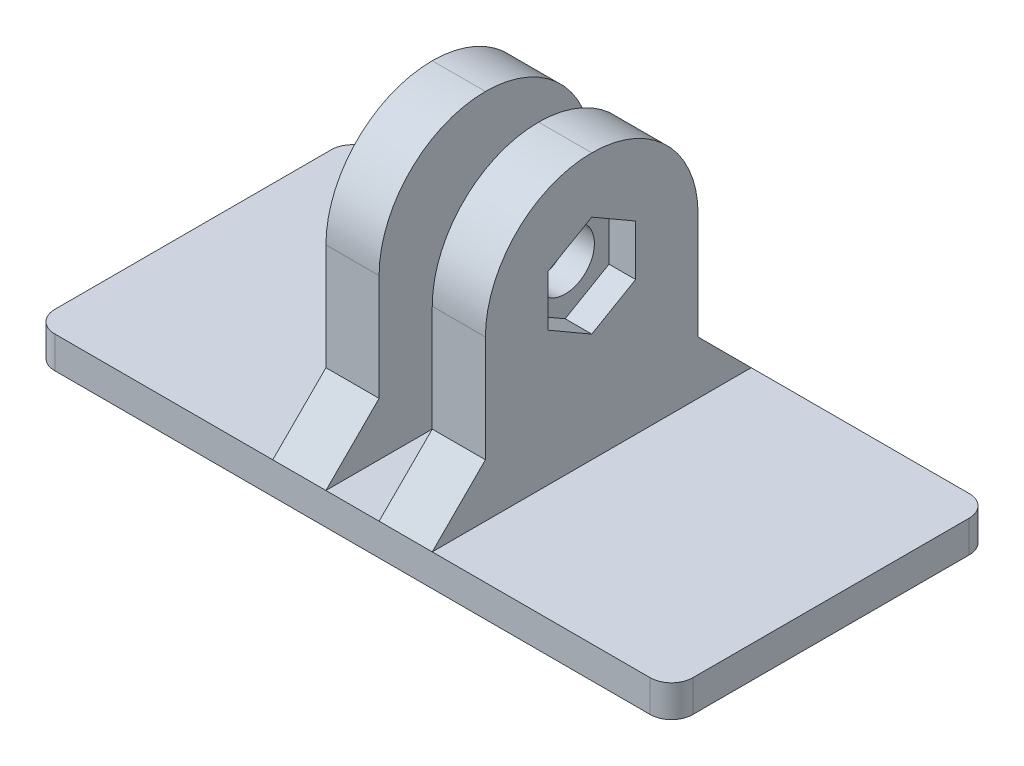
ISO-10303-21;
HEADER;
FILE_DESCRIPTION(('STEP AP214'),'2;1');
FILE_NAME('part.step','',(''),(''),'','','');
FILE_SCHEMA(('AUTOMOTIVE_DESIGN { 1 0 10303 214 1 1 1 1 }'));
ENDSEC;
DATA;
#1=APPLICATION_CONTEXT('core data for automotive mechanical design processes');
#2=APPLICATION_PROTOCOL_DEFINITION('international standard','automotive_design',2000,#1);
#3=PRODUCT_CONTEXT('',#1,'mechanical');
#4=PRODUCT('Part','Part','',(#3));
#5=PRODUCT_RELATED_PRODUCT_CATEGORY('part','',(#4));
#6=PRODUCT_DEFINITION_FORMATION('','',#4);
#7=PRODUCT_DEFINITION_CONTEXT('part definition',#1,'design');
#8=PRODUCT_DEFINITION('design','',#6,#7);
#9=PRODUCT_DEFINITION_SHAPE('','',#8);
#10=(LENGTH_UNIT() NAMED_UNIT(*) SI_UNIT(.MILLI.,.METRE.));
#11=(NAMED_UNIT(*) PLANE_ANGLE_UNIT() SI_UNIT($,.RADIAN.));
#12=(NAMED_UNIT(*) SI_UNIT($,.STERADIAN.) SOLID_ANGLE_UNIT());
#13=UNCERTAINTY_MEASURE_WITH_UNIT(LENGTH_MEASURE(1.E-05),#10,'distance_accuracy_value','');
#14=(GEOMETRIC_REPRESENTATION_CONTEXT(3) GLOBAL_UNCERTAINTY_ASSIGNED_CONTEXT((#13)) GLOBAL_UNIT_ASSIGNED_CONTEXT((#10,
#11,#12)) REPRESENTATION_CONTEXT('',''));
#15=CARTESIAN_POINT('',(0.,0.,0.));
#16=DIRECTION('',(0.,0.,1.));
#17=DIRECTION('',(1.,0.,0.));
#18=AXIS2_PLACEMENT_3D('',#15,#16,#17);
#19=CARTESIAN_POINT('',(0.,3.,0.));
#20=DIRECTION('',(0.,1.,0.));
#21=DIRECTION('',(0.,0.,1.));
#22=AXIS2_PLACEMENT_3D('',#19,#20,#21);
#23=PLANE('',#22);
#24=DIRECTION('',(0.,0.,1.));
#25=VECTOR('',#24,1.);
#26=CARTESIAN_POINT('',(2.49999999999994,3.,-9.99999999999999));
#27=LINE('',#26,#25);
#28=CARTESIAN_POINT('',(2.49999999999994,3.,-15.));
#29=VERTEX_POINT('',#28);
#30=CARTESIAN_POINT('',(2.49999999999994,3.,15.));
#31=VERTEX_POINT('',#30);
#32=EDGE_CURVE('E316',#29,#31,#27,.T.);
#33=ORIENTED_EDGE('',*,*,#32,.F.);
#34=DIRECTION('',(-1.,0.,0.));
#35=VECTOR('',#34,1.);
#36=CARTESIAN_POINT('',(-30.,3.,-15.));
#37=LINE('',#36,#35);
#38=CARTESIAN_POINT('',(-2.5,3.,-15.));
#39=VERTEX_POINT('',#38);
#40=EDGE_CURVE('E943',#29,#39,#37,.T.);
#41=ORIENTED_EDGE('',*,*,#40,.T.);
#42=DIRECTION('',(0.,0.,-1.));
#43=VECTOR('',#42,1.);
#44=CARTESIAN_POINT('',(-2.5,3.,-9.99999999999999));
#45=LINE('',#44,#43);
#46=CARTESIAN_POINT('',(-2.5,3.,15.));
#47=VERTEX_POINT('',#46);
#48=EDGE_CURVE('E338',#47,#39,#45,.T.);
#49=ORIENTED_EDGE('',*,*,#48,.F.);
#50=DIRECTION('',(1.,0.,0.));
#51=VECTOR('',#50,1.);
#52=CARTESIAN_POINT('',(-30.,3.,15.));
#53=LINE('',#52,#51);
#54=EDGE_CURVE('E549',#47,#31,#53,.T.);
#55=ORIENTED_EDGE('',*,*,#54,.T.);
#56=EDGE_LOOP('',(#33,#41,#49,#55));
#57=FACE_BOUND('',#56,.T.);
#58=ADVANCED_FACE('F39',(#57),#23,.T.);
#59=DIRECTION('',(0.,0.,1.));
#60=VECTOR('',#59,1.);
#61=CARTESIAN_POINT('',(-7.5,3.,-10.));
#62=LINE('',#61,#60);
#63=CARTESIAN_POINT('',(-7.5,3.,-15.));
#64=VERTEX_POINT('',#63);
#65=CARTESIAN_POINT('',(-7.5,3.,15.));
#66=VERTEX_POINT('',#65);
#67=EDGE_CURVE('E341',#64,#66,#62,.T.);
#68=ORIENTED_EDGE('',*,*,#67,.F.);
#69=CARTESIAN_POINT('',(-28.,3.,-15.));
#70=VERTEX_POINT('',#69);
#71=EDGE_CURVE('E376',#64,#70,#37,.T.);
#72=ORIENTED_EDGE('',*,*,#71,.T.);
#73=CARTESIAN_POINT('',(-28.,3.,-13.));
#74=DIRECTION('',(0.,1.,0.));
#75=DIRECTION('',(0.,0.,1.));
#76=AXIS2_PLACEMENT_3D('',#73,#74,#75);
#77=CIRCLE('',#76,2.);
#78=CARTESIAN_POINT('',(-30.,3.,-13.));
#79=VERTEX_POINT('',#78);
#80=EDGE_CURVE('E423',#70,#79,#77,.T.);
#81=ORIENTED_EDGE('',*,*,#80,.T.);
#82=DIRECTION('',(0.,0.,1.));
#83=VECTOR('',#82,1.);
#84=CARTESIAN_POINT('',(-30.,3.,-15.));
#85=LINE('',#84,#83);
#86=CARTESIAN_POINT('',(-30.,3.,13.));
#87=VERTEX_POINT('',#86);
#88=EDGE_CURVE('E361',#79,#87,#85,.T.);
#89=ORIENTED_EDGE('',*,*,#88,.T.);
#90=CARTESIAN_POINT('',(-28.,3.,13.));
#91=DIRECTION('',(0.,1.,0.));
#92=DIRECTION('',(0.,0.,1.));
#93=AXIS2_PLACEMENT_3D('',#90,#91,#92);
#94=CIRCLE('',#93,2.);
#95=CARTESIAN_POINT('',(-28.,3.,15.));
#96=VERTEX_POINT('',#95);
#97=EDGE_CURVE('E426',#87,#96,#94,.T.);
#98=ORIENTED_EDGE('',*,*,#97,.T.);
#99=EDGE_CURVE('E367',#96,#66,#53,.T.);
#100=ORIENTED_EDGE('',*,*,#99,.T.);
#101=EDGE_LOOP('',(#68,#72,#81,#89,#98,#100));
#102=FACE_BOUND('',#101,.T.);
#103=ADVANCED_FACE('F562',(#102),#23,.T.);
#104=CARTESIAN_POINT('',(30.,18.,0.));
#105=DIRECTION('',(-1.,0.,0.));
#106=DIRECTION('',(0.,0.,1.));
#107=AXIS2_PLACEMENT_3D('',#104,#105,#106);
#108=CYLINDRICAL_SURFACE('',#107,2.75);
#109=CARTESIAN_POINT('',(2.49999999999994,18.,0.));
#110=DIRECTION('',(1.,0.,0.));
#111=DIRECTION('',(0.,0.,-1.));
#112=AXIS2_PLACEMENT_3D('',#109,#110,#111);
#113=CIRCLE('',#112,2.75);
#114=CARTESIAN_POINT('',(2.49999999999994,18.,-2.75));
#115=VERTEX_POINT('',#114);
#116=EDGE_CURVE('E303',#115,#115,#113,.T.);
#117=ORIENTED_EDGE('',*,*,#116,.F.);
#118=EDGE_LOOP('',(#117));
#119=FACE_BOUND('',#118,.T.);
#120=CARTESIAN_POINT('',(4.99999999999994,18.,0.));
#121=DIRECTION('',(1.,0.,0.));
#122=DIRECTION('',(0.,0.,-1.));
#123=AXIS2_PLACEMENT_3D('',#120,#121,#122);
#124=CIRCLE('',#123,2.75);
#125=CARTESIAN_POINT('',(4.99999999999994,18.,-2.75));
#126=VERTEX_POINT('',#125);
#127=EDGE_CURVE('E291',#126,#126,#124,.F.);
#128=ORIENTED_EDGE('',*,*,#127,.F.);
#129=EDGE_LOOP('',(#128));
#130=FACE_BOUND('',#129,.T.);
#131=ADVANCED_FACE('F603',(#119,#130),#108,.F.);
#132=CARTESIAN_POINT('',(28.,3.,-15.));
#133=VERTEX_POINT('',#132);
#134=CARTESIAN_POINT('',(7.49999999999994,3.,-15.));
#135=VERTEX_POINT('',#134);
#136=EDGE_CURVE('E377',#133,#135,#37,.T.);
#137=ORIENTED_EDGE('',*,*,#136,.T.);
#138=DIRECTION('',(0.,0.,-1.));
#139=VECTOR('',#138,1.);
#140=CARTESIAN_POINT('',(7.49999999999994,3.,-10.));
#141=LINE('',#140,#139);
#142=CARTESIAN_POINT('',(7.49999999999994,3.,15.));
#143=VERTEX_POINT('',#142);
#144=EDGE_CURVE('E319',#143,#135,#141,.T.);
#145=ORIENTED_EDGE('',*,*,#144,.F.);
#146=CARTESIAN_POINT('',(28.,3.,15.));
#147=VERTEX_POINT('',#146);
#148=EDGE_CURVE('E365',#143,#147,#53,.T.);
#149=ORIENTED_EDGE('',*,*,#148,.T.);
#150=CARTESIAN_POINT('',(28.,3.,13.));
#151=DIRECTION('',(0.,1.,0.));
#152=DIRECTION('',(0.,0.,1.));
#153=AXIS2_PLACEMENT_3D('',#150,#151,#152);
#154=CIRCLE('',#153,2.);
#155=CARTESIAN_POINT('',(30.,3.,13.));
#156=VERTEX_POINT('',#155);
#157=EDGE_CURVE('E429',#147,#156,#154,.T.);
#158=ORIENTED_EDGE('',*,*,#157,.T.);
#159=DIRECTION('',(0.,0.,-1.));
#160=VECTOR('',#159,1.);
#161=CARTESIAN_POINT('',(30.,3.,-15.));
#162=LINE('',#161,#160);
#163=CARTESIAN_POINT('',(30.,3.,-13.));
#164=VERTEX_POINT('',#163);
#165=EDGE_CURVE('E371',#156,#164,#162,.T.);
#166=ORIENTED_EDGE('',*,*,#165,.T.);
#167=CARTESIAN_POINT('',(28.,3.,-13.));
#168=DIRECTION('',(0.,1.,0.));
#169=DIRECTION('',(0.,0.,1.));
#170=AXIS2_PLACEMENT_3D('',#167,#168,#169);
#171=CIRCLE('',#170,2.);
#172=EDGE_CURVE('E432',#164,#133,#171,.T.);
#173=ORIENTED_EDGE('',*,*,#172,.T.);
#174=EDGE_LOOP('',(#137,#145,#149,#158,#166,#173));
#175=FACE_BOUND('',#174,.T.);
#176=ADVANCED_FACE('F582',(#175),#23,.T.);
#177=CARTESIAN_POINT('',(-30.,3.,-15.));
#178=DIRECTION('',(1.,0.,0.));
#179=DIRECTION('',(0.,0.,-1.));
#180=AXIS2_PLACEMENT_3D('',#177,#178,#179);
#181=PLANE('',#180);
#182=DIRECTION('',(0.,0.,1.));
#183=VECTOR('',#182,1.);
#184=CARTESIAN_POINT('',(-30.,0.,-15.));
#185=LINE('',#184,#183);
#186=CARTESIAN_POINT('',(-30.,0.,-13.));
#187=VERTEX_POINT('',#186);
#188=CARTESIAN_POINT('',(-30.,0.,13.));
#189=VERTEX_POINT('',#188);
#190=EDGE_CURVE('E360',#187,#189,#185,.T.);
#191=ORIENTED_EDGE('',*,*,#190,.T.);
#192=DIRECTION('',(0.,-1.,0.));
#193=VECTOR('',#192,1.);
#194=CARTESIAN_POINT('',(-30.,3.,13.));
#195=LINE('',#194,#193);
#196=EDGE_CURVE('E447',#189,#87,#195,.F.);
#197=ORIENTED_EDGE('',*,*,#196,.T.);
#198=ORIENTED_EDGE('',*,*,#88,.F.);
#199=DIRECTION('',(0.,-1.,0.));
#200=VECTOR('',#199,1.);
#201=CARTESIAN_POINT('',(-30.,3.,-13.));
#202=LINE('',#201,#200);
#203=EDGE_CURVE('E443',#79,#187,#202,.T.);
#204=ORIENTED_EDGE('',*,*,#203,.T.);
#205=EDGE_LOOP('',(#191,#197,#198,#204));
#206=FACE_BOUND('',#205,.T.);
#207=ADVANCED_FACE('F595',(#206),#181,.F.);
#208=CARTESIAN_POINT('',(-30.,3.,15.));
#209=DIRECTION('',(0.,0.,-1.));
#210=DIRECTION('',(-1.,0.,0.));
#211=AXIS2_PLACEMENT_3D('',#208,#209,#210);
#212=PLANE('',#211);
#213=DIRECTION('',(1.,0.,0.));
#214=VECTOR('',#213,1.);
#215=CARTESIAN_POINT('',(-30.,0.,15.));
#216=LINE('',#215,#214);
#217=CARTESIAN_POINT('',(-28.,0.,15.));
#218=VERTEX_POINT('',#217);
#219=CARTESIAN_POINT('',(28.,0.,15.));
#220=VERTEX_POINT('',#219);
#221=EDGE_CURVE('E386',#218,#220,#216,.T.);
#222=ORIENTED_EDGE('',*,*,#221,.T.);
#223=DIRECTION('',(0.,-1.,0.));
#224=VECTOR('',#223,1.);
#225=CARTESIAN_POINT('',(28.,3.,15.));
#226=LINE('',#225,#224);
#227=EDGE_CURVE('E439',#220,#147,#226,.F.);
#228=ORIENTED_EDGE('',*,*,#227,.T.);
#229=ORIENTED_EDGE('',*,*,#148,.F.);
#230=EDGE_CURVE('E542',#31,#143,#53,.T.);
#231=ORIENTED_EDGE('',*,*,#230,.F.);
#232=ORIENTED_EDGE('',*,*,#54,.F.);
#233=EDGE_CURVE('E372',#66,#47,#53,.T.);
#234=ORIENTED_EDGE('',*,*,#233,.F.);
#235=ORIENTED_EDGE('',*,*,#99,.F.);
#236=DIRECTION('',(0.,-1.,0.));
#237=VECTOR('',#236,1.);
#238=CARTESIAN_POINT('',(-28.,3.,15.));
#239=LINE('',#238,#237);
#240=EDGE_CURVE('E435',#96,#218,#239,.T.);
#241=ORIENTED_EDGE('',*,*,#240,.T.);
#242=EDGE_LOOP('',(#222,#228,#229,#231,#232,#234,#235,#241));
#243=FACE_BOUND('',#242,.T.);
#244=ADVANCED_FACE('F540',(#243),#212,.F.);
#245=CARTESIAN_POINT('',(30.,3.,-15.));
#246=DIRECTION('',(-1.,0.,0.));
#247=DIRECTION('',(0.,0.,1.));
#248=AXIS2_PLACEMENT_3D('',#245,#246,#247);
#249=PLANE('',#248);
#250=DIRECTION('',(0.,0.,-1.));
#251=VECTOR('',#250,1.);
#252=CARTESIAN_POINT('',(30.,0.,-15.));
#253=LINE('',#252,#251);
#254=CARTESIAN_POINT('',(30.,0.,13.));
#255=VERTEX_POINT('',#254);
#256=CARTESIAN_POINT('',(30.,0.,-13.));
#257=VERTEX_POINT('',#256);
#258=EDGE_CURVE('E390',#255,#257,#253,.T.);
#259=ORIENTED_EDGE('',*,*,#258,.T.);
#260=DIRECTION('',(0.,-1.,0.));
#261=VECTOR('',#260,1.);
#262=CARTESIAN_POINT('',(30.,3.,-13.));
#263=LINE('',#262,#261);
#264=EDGE_CURVE('E420',#257,#164,#263,.F.);
#265=ORIENTED_EDGE('',*,*,#264,.T.);
#266=ORIENTED_EDGE('',*,*,#165,.F.);
#267=DIRECTION('',(0.,-1.,0.));
#268=VECTOR('',#267,1.);
#269=CARTESIAN_POINT('',(30.,3.,13.));
#270=LINE('',#269,#268);
#271=EDGE_CURVE('E416',#156,#255,#270,.T.);
#272=ORIENTED_EDGE('',*,*,#271,.T.);
#273=EDGE_LOOP('',(#259,#265,#266,#272));
#274=FACE_BOUND('',#273,.T.);
#275=ADVANCED_FACE('F579',(#274),#249,.F.);
#276=CARTESIAN_POINT('',(-30.,3.,-15.));
#277=DIRECTION('',(0.,0.,1.));
#278=DIRECTION('',(1.,0.,0.));
#279=AXIS2_PLACEMENT_3D('',#276,#277,#278);
#280=PLANE('',#279);
#281=ORIENTED_EDGE('',*,*,#136,.F.);
#282=DIRECTION('',(0.,-1.,0.));
#283=VECTOR('',#282,1.);
#284=CARTESIAN_POINT('',(28.,3.,-15.));
#285=LINE('',#284,#283);
#286=CARTESIAN_POINT('',(28.,0.,-15.));
#287=VERTEX_POINT('',#286);
#288=EDGE_CURVE('E400',#133,#287,#285,.T.);
#289=ORIENTED_EDGE('',*,*,#288,.T.);
#290=DIRECTION('',(-1.,0.,0.));
#291=VECTOR('',#290,1.);
#292=CARTESIAN_POINT('',(-30.,0.,-15.));
#293=LINE('',#292,#291);
#294=CARTESIAN_POINT('',(-28.,0.,-15.));
#295=VERTEX_POINT('',#294);
#296=EDGE_CURVE('E366',#287,#295,#293,.T.);
#297=ORIENTED_EDGE('',*,*,#296,.T.);
#298=DIRECTION('',(0.,-1.,0.));
#299=VECTOR('',#298,1.);
#300=CARTESIAN_POINT('',(-28.,3.,-15.));
#301=LINE('',#300,#299);
#302=EDGE_CURVE('E381',#295,#70,#301,.F.);
#303=ORIENTED_EDGE('',*,*,#302,.T.);
#304=ORIENTED_EDGE('',*,*,#71,.F.);
#305=EDGE_CURVE('E946',#39,#64,#37,.T.);
#306=ORIENTED_EDGE('',*,*,#305,.F.);
#307=ORIENTED_EDGE('',*,*,#40,.F.);
#308=EDGE_CURVE('E382',#135,#29,#37,.T.);
#309=ORIENTED_EDGE('',*,*,#308,.F.);
#310=EDGE_LOOP('',(#281,#289,#297,#303,#304,#306,#307,#309));
#311=FACE_BOUND('',#310,.T.);
#312=ADVANCED_FACE('F588',(#311),#280,.F.);
#313=CARTESIAN_POINT('',(0.,0.,0.));
#314=DIRECTION('',(0.,1.,0.));
#315=DIRECTION('',(0.,0.,1.));
#316=AXIS2_PLACEMENT_3D('',#313,#314,#315);
#317=PLANE('',#316);
#318=ORIENTED_EDGE('',*,*,#296,.F.);
#319=CARTESIAN_POINT('',(28.,0.,-13.));
#320=DIRECTION('',(0.,1.,0.));
#321=DIRECTION('',(0.,0.,1.));
#322=AXIS2_PLACEMENT_3D('',#319,#320,#321);
#323=CIRCLE('',#322,2.);
#324=EDGE_CURVE('E413',#287,#257,#323,.F.);
#325=ORIENTED_EDGE('',*,*,#324,.T.);
#326=ORIENTED_EDGE('',*,*,#258,.F.);
#327=CARTESIAN_POINT('',(28.,0.,13.));
#328=DIRECTION('',(0.,1.,0.));
#329=DIRECTION('',(0.,0.,1.));
#330=AXIS2_PLACEMENT_3D('',#327,#328,#329);
#331=CIRCLE('',#330,2.);
#332=EDGE_CURVE('E410',#255,#220,#331,.F.);
#333=ORIENTED_EDGE('',*,*,#332,.T.);
#334=ORIENTED_EDGE('',*,*,#221,.F.);
#335=CARTESIAN_POINT('',(-28.,0.,13.));
#336=DIRECTION('',(0.,1.,0.));
#337=DIRECTION('',(0.,0.,1.));
#338=AXIS2_PLACEMENT_3D('',#335,#336,#337);
#339=CIRCLE('',#338,2.);
#340=EDGE_CURVE('E407',#218,#189,#339,.F.);
#341=ORIENTED_EDGE('',*,*,#340,.T.);
#342=ORIENTED_EDGE('',*,*,#190,.F.);
#343=CARTESIAN_POINT('',(-28.,0.,-13.));
#344=DIRECTION('',(0.,1.,0.));
#345=DIRECTION('',(0.,0.,1.));
#346=AXIS2_PLACEMENT_3D('',#343,#344,#345);
#347=CIRCLE('',#346,2.);
#348=EDGE_CURVE('E404',#187,#295,#347,.F.);
#349=ORIENTED_EDGE('',*,*,#348,.T.);
#350=EDGE_LOOP('',(#318,#325,#326,#333,#334,#341,#342,#349));
#351=FACE_BOUND('',#350,.T.);
#352=ADVANCED_FACE('F571',(#351),#317,.F.);
#353=CARTESIAN_POINT('',(28.,3.,-13.));
#354=DIRECTION('',(0.,-1.,0.));
#355=DIRECTION('',(0.,0.,-1.));
#356=AXIS2_PLACEMENT_3D('',#353,#354,#355);
#357=CYLINDRICAL_SURFACE('',#356,2.);
#358=ORIENTED_EDGE('',*,*,#172,.F.);
#359=ORIENTED_EDGE('',*,*,#264,.F.);
#360=ORIENTED_EDGE('',*,*,#324,.F.);
#361=ORIENTED_EDGE('',*,*,#288,.F.);
#362=EDGE_LOOP('',(#358,#359,#360,#361));
#363=FACE_BOUND('',#362,.T.);
#364=ADVANCED_FACE('F586',(#363),#357,.T.);
#365=CARTESIAN_POINT('',(28.,3.,13.));
#366=DIRECTION('',(0.,-1.,0.));
#367=DIRECTION('',(0.,0.,-1.));
#368=AXIS2_PLACEMENT_3D('',#365,#366,#367);
#369=CYLINDRICAL_SURFACE('',#368,2.);
#370=ORIENTED_EDGE('',*,*,#157,.F.);
#371=ORIENTED_EDGE('',*,*,#227,.F.);
#372=ORIENTED_EDGE('',*,*,#332,.F.);
#373=ORIENTED_EDGE('',*,*,#271,.F.);
#374=EDGE_LOOP('',(#370,#371,#372,#373));
#375=FACE_BOUND('',#374,.T.);
#376=ADVANCED_FACE('F576',(#375),#369,.T.);
#377=CARTESIAN_POINT('',(-28.,3.,13.));
#378=DIRECTION('',(0.,-1.,0.));
#379=DIRECTION('',(0.,0.,-1.));
#380=AXIS2_PLACEMENT_3D('',#377,#378,#379);
#381=CYLINDRICAL_SURFACE('',#380,2.);
#382=ORIENTED_EDGE('',*,*,#97,.F.);
#383=ORIENTED_EDGE('',*,*,#196,.F.);
#384=ORIENTED_EDGE('',*,*,#340,.F.);
#385=ORIENTED_EDGE('',*,*,#240,.F.);
#386=EDGE_LOOP('',(#382,#383,#384,#385));
#387=FACE_BOUND('',#386,.T.);
#388=ADVANCED_FACE('F567',(#387),#381,.T.);
#389=CARTESIAN_POINT('',(-28.,3.,-13.));
#390=DIRECTION('',(0.,-1.,0.));
#391=DIRECTION('',(0.,0.,-1.));
#392=AXIS2_PLACEMENT_3D('',#389,#390,#391);
#393=CYLINDRICAL_SURFACE('',#392,2.);
#394=ORIENTED_EDGE('',*,*,#80,.F.);
#395=ORIENTED_EDGE('',*,*,#302,.F.);
#396=ORIENTED_EDGE('',*,*,#348,.F.);
#397=ORIENTED_EDGE('',*,*,#203,.F.);
#398=EDGE_LOOP('',(#394,#395,#396,#397));
#399=FACE_BOUND('',#398,.T.);
#400=ADVANCED_FACE('F593',(#399),#393,.T.);
#401=CARTESIAN_POINT('',(-2.5,28.,-9.99999999999999));
#402=DIRECTION('',(-1.,0.,0.));
#403=DIRECTION('',(0.,0.,1.));
#404=AXIS2_PLACEMENT_3D('',#401,#402,#403);
#405=PLANE('',#404);
#406=CARTESIAN_POINT('',(-2.5,18.,0.));
#407=DIRECTION('',(-1.,0.,0.));
#408=DIRECTION('',(0.,0.,1.));
#409=AXIS2_PLACEMENT_3D('',#406,#407,#408);
#410=CIRCLE('',#409,2.75);
#411=CARTESIAN_POINT('',(-2.5,18.,2.75));
#412=VERTEX_POINT('',#411);
#413=EDGE_CURVE('E311',#412,#412,#410,.T.);
#414=ORIENTED_EDGE('',*,*,#413,.T.);
#415=EDGE_LOOP('',(#414));
#416=FACE_BOUND('',#415,.T.);
#417=DIRECTION('',(0.,-1.,0.));
#418=VECTOR('',#417,1.);
#419=CARTESIAN_POINT('',(-2.5,28.,-9.99999999999999));
#420=LINE('',#419,#418);
#421=CARTESIAN_POINT('',(-2.5,18.,-9.99999999999999));
#422=VERTEX_POINT('',#421);
#423=CARTESIAN_POINT('',(-2.5,8.00000000000002,-9.99999999999999));
#424=VERTEX_POINT('',#423);
#425=EDGE_CURVE('E356',#422,#424,#420,.T.);
#426=ORIENTED_EDGE('',*,*,#425,.F.);
#427=CARTESIAN_POINT('',(-2.5,18.,0.));
#428=DIRECTION('',(-1.,0.,0.));
#429=DIRECTION('',(0.,0.,1.));
#430=AXIS2_PLACEMENT_3D('',#427,#428,#429);
#431=CIRCLE('',#430,10.);
#432=CARTESIAN_POINT('',(-2.5,28.,0.));
#433=VERTEX_POINT('',#432);
#434=EDGE_CURVE('E482',#422,#433,#431,.F.);
#435=ORIENTED_EDGE('',*,*,#434,.T.);
#436=CARTESIAN_POINT('',(-2.5,18.,0.));
#437=DIRECTION('',(-1.,0.,0.));
#438=DIRECTION('',(0.,0.,1.));
#439=AXIS2_PLACEMENT_3D('',#436,#437,#438);
#440=CIRCLE('',#439,10.);
#441=CARTESIAN_POINT('',(-2.5,18.,9.99999999999999));
#442=VERTEX_POINT('',#441);
#443=EDGE_CURVE('E479',#433,#442,#440,.F.);
#444=ORIENTED_EDGE('',*,*,#443,.T.);
#445=DIRECTION('',(0.,-1.,0.));
#446=VECTOR('',#445,1.);
#447=CARTESIAN_POINT('',(-2.5,28.,9.99999999999999));
#448=LINE('',#447,#446);
#449=CARTESIAN_POINT('',(-2.5,8.00000000000002,9.99999999999999));
#450=VERTEX_POINT('',#449);
#451=EDGE_CURVE('E344',#442,#450,#448,.T.);
#452=ORIENTED_EDGE('',*,*,#451,.T.);
#453=DIRECTION('',(0.,-0.707106781186551,0.707106781186544));
#454=VECTOR('',#453,1.);
#455=CARTESIAN_POINT('',(-2.5,28.0000000000001,-9.99999999999989));
#456=LINE('',#455,#454);
#457=EDGE_CURVE('E526',#450,#47,#456,.T.);
#458=ORIENTED_EDGE('',*,*,#457,.T.);
#459=ORIENTED_EDGE('',*,*,#48,.T.);
#460=DIRECTION('',(0.,0.707106781186551,0.707106781186544));
#461=VECTOR('',#460,1.);
#462=CARTESIAN_POINT('',(-2.5,18.0000000000001,0.));
#463=LINE('',#462,#461);
#464=EDGE_CURVE('E523',#39,#424,#463,.T.);
#465=ORIENTED_EDGE('',*,*,#464,.T.);
#466=EDGE_LOOP('',(#426,#435,#444,#452,#458,#459,#465));
#467=FACE_BOUND('',#466,.T.);
#468=ADVANCED_FACE('F612',(#416,#467),#405,.F.);
#469=CARTESIAN_POINT('',(-2.5,28.,-9.99999999999999));
#470=DIRECTION('',(0.,0.,1.));
#471=DIRECTION('',(1.,0.,0.));
#472=AXIS2_PLACEMENT_3D('',#469,#470,#471);
#473=PLANE('',#472);
#474=ORIENTED_EDGE('',*,*,#425,.T.);
#475=DIRECTION('',(-1.,0.,0.));
#476=VECTOR('',#475,1.);
#477=CARTESIAN_POINT('',(-2.5,8.00000000000002,-9.99999999999999));
#478=LINE('',#477,#476);
#479=CARTESIAN_POINT('',(-7.5,8.00000000000002,-10.));
#480=VERTEX_POINT('',#479);
#481=EDGE_CURVE('E501',#424,#480,#478,.T.);
#482=ORIENTED_EDGE('',*,*,#481,.T.);
#483=DIRECTION('',(0.,-1.,0.));
#484=VECTOR('',#483,1.);
#485=CARTESIAN_POINT('',(-7.5,28.,-10.));
#486=LINE('',#485,#484);
#487=CARTESIAN_POINT('',(-7.5,18.,-10.));
#488=VERTEX_POINT('',#487);
#489=EDGE_CURVE('E352',#488,#480,#486,.T.);
#490=ORIENTED_EDGE('',*,*,#489,.F.);
#491=DIRECTION('',(-1.,0.,0.));
#492=VECTOR('',#491,1.);
#493=CARTESIAN_POINT('',(-2.5,18.,-9.99999999999999));
#494=LINE('',#493,#492);
#495=EDGE_CURVE('E475',#488,#422,#494,.F.);
#496=ORIENTED_EDGE('',*,*,#495,.T.);
#497=EDGE_LOOP('',(#474,#482,#490,#496));
#498=FACE_BOUND('',#497,.T.);
#499=ADVANCED_FACE('F661',(#498),#473,.F.);
#500=CARTESIAN_POINT('',(-7.5,28.,-10.));
#501=DIRECTION('',(1.,0.,0.));
#502=DIRECTION('',(0.,0.,-1.));
#503=AXIS2_PLACEMENT_3D('',#500,#501,#502);
#504=PLANE('',#503);
#505=CARTESIAN_POINT('',(-7.5,18.,0.));
#506=DIRECTION('',(1.,0.,0.));
#507=DIRECTION('',(0.,0.,-1.));
#508=AXIS2_PLACEMENT_3D('',#505,#506,#507);
#509=CIRCLE('',#508,2.75);
#510=CARTESIAN_POINT('',(-7.5,18.,-2.75));
#511=VERTEX_POINT('',#510);
#512=EDGE_CURVE('E307',#511,#511,#509,.T.);
#513=ORIENTED_EDGE('',*,*,#512,.T.);
#514=EDGE_LOOP('',(#513));
#515=FACE_BOUND('',#514,.T.);
#516=CARTESIAN_POINT('',(-7.5,18.,0.));
#517=DIRECTION('',(1.,0.,0.));
#518=DIRECTION('',(0.,0.,-1.));
#519=AXIS2_PLACEMENT_3D('',#516,#517,#518);
#520=CIRCLE('',#519,10.);
#521=CARTESIAN_POINT('',(-7.5,18.,10.));
#522=VERTEX_POINT('',#521);
#523=CARTESIAN_POINT('',(-7.5,28.,0.));
#524=VERTEX_POINT('',#523);
#525=EDGE_CURVE('E469',#522,#524,#520,.F.);
#526=ORIENTED_EDGE('',*,*,#525,.T.);
#527=CARTESIAN_POINT('',(-7.5,18.,0.));
#528=DIRECTION('',(1.,0.,0.));
#529=DIRECTION('',(0.,0.,-1.));
#530=AXIS2_PLACEMENT_3D('',#527,#528,#529);
#531=CIRCLE('',#530,10.);
#532=EDGE_CURVE('E472',#524,#488,#531,.F.);
#533=ORIENTED_EDGE('',*,*,#532,.T.);
#534=ORIENTED_EDGE('',*,*,#489,.T.);
#535=DIRECTION('',(0.,-0.707106781186551,-0.707106781186544));
#536=VECTOR('',#535,1.);
#537=CARTESIAN_POINT('',(-7.5,18.0000000000001,0.));
#538=LINE('',#537,#536);
#539=EDGE_CURVE('E519',#480,#64,#538,.T.);
#540=ORIENTED_EDGE('',*,*,#539,.T.);
#541=ORIENTED_EDGE('',*,*,#67,.T.);
#542=DIRECTION('',(0.,0.707106781186551,-0.707106781186544));
#543=VECTOR('',#542,1.);
#544=CARTESIAN_POINT('',(-7.5,28.0000000000001,-9.99999999999989));
#545=LINE('',#544,#543);
#546=CARTESIAN_POINT('',(-7.5,8.00000000000002,10.));
#547=VERTEX_POINT('',#546);
#548=EDGE_CURVE('E530',#66,#547,#545,.T.);
#549=ORIENTED_EDGE('',*,*,#548,.T.);
#550=DIRECTION('',(0.,-1.,0.));
#551=VECTOR('',#550,1.);
#552=CARTESIAN_POINT('',(-7.5,28.,10.));
#553=LINE('',#552,#551);
#554=EDGE_CURVE('E348',#522,#547,#553,.T.);
#555=ORIENTED_EDGE('',*,*,#554,.F.);
#556=EDGE_LOOP('',(#526,#533,#534,#540,#541,#549,#555));
#557=FACE_BOUND('',#556,.T.);
#558=ADVANCED_FACE('F668',(#515,#557),#504,.F.);
#559=CARTESIAN_POINT('',(-2.5,28.,9.99999999999999));
#560=DIRECTION('',(0.,0.,-1.));
#561=DIRECTION('',(-1.,0.,0.));
#562=AXIS2_PLACEMENT_3D('',#559,#560,#561);
#563=PLANE('',#562);
#564=ORIENTED_EDGE('',*,*,#554,.T.);
#565=DIRECTION('',(1.,0.,0.));
#566=VECTOR('',#565,1.);
#567=CARTESIAN_POINT('',(-2.5,8.00000000000002,9.99999999999999));
#568=LINE('',#567,#566);
#569=EDGE_CURVE('E505',#547,#450,#568,.T.);
#570=ORIENTED_EDGE('',*,*,#569,.T.);
#571=ORIENTED_EDGE('',*,*,#451,.F.);
#572=DIRECTION('',(1.,0.,0.));
#573=VECTOR('',#572,1.);
#574=CARTESIAN_POINT('',(-2.5,18.,9.99999999999999));
#575=LINE('',#574,#573);
#576=EDGE_CURVE('E485',#442,#522,#575,.F.);
#577=ORIENTED_EDGE('',*,*,#576,.T.);
#578=EDGE_LOOP('',(#564,#570,#571,#577));
#579=FACE_BOUND('',#578,.T.);
#580=ADVANCED_FACE('F675',(#579),#563,.F.);
#581=CARTESIAN_POINT('',(2.49999999999994,28.,-9.99999999999999));
#582=DIRECTION('',(0.,0.,1.));
#583=DIRECTION('',(1.,0.,0.));
#584=AXIS2_PLACEMENT_3D('',#581,#582,#583);
#585=PLANE('',#584);
#586=DIRECTION('',(0.,-1.,0.));
#587=VECTOR('',#586,1.);
#588=CARTESIAN_POINT('',(7.49999999999994,28.,-10.));
#589=LINE('',#588,#587);
#590=CARTESIAN_POINT('',(7.49999999999994,18.,-10.));
#591=VERTEX_POINT('',#590);
#592=CARTESIAN_POINT('',(7.49999999999994,8.00000000000002,-10.));
#593=VERTEX_POINT('',#592);
#594=EDGE_CURVE('E323',#591,#593,#589,.T.);
#595=ORIENTED_EDGE('',*,*,#594,.T.);
#596=DIRECTION('',(-1.,0.,0.));
#597=VECTOR('',#596,1.);
#598=CARTESIAN_POINT('',(2.49999999999994,8.00000000000002,-9.99999999999999));
#599=LINE('',#598,#597);
#600=CARTESIAN_POINT('',(2.49999999999994,8.00000000000002,-9.99999999999999));
#601=VERTEX_POINT('',#600);
#602=EDGE_CURVE('E488',#593,#601,#599,.T.);
#603=ORIENTED_EDGE('',*,*,#602,.T.);
#604=DIRECTION('',(0.,-1.,0.));
#605=VECTOR('',#604,1.);
#606=CARTESIAN_POINT('',(2.49999999999994,28.,-9.99999999999999));
#607=LINE('',#606,#605);
#608=CARTESIAN_POINT('',(2.49999999999994,18.,-9.99999999999999));
#609=VERTEX_POINT('',#608);
#610=EDGE_CURVE('E334',#609,#601,#607,.T.);
#611=ORIENTED_EDGE('',*,*,#610,.F.);
#612=DIRECTION('',(-1.,0.,0.));
#613=VECTOR('',#612,1.);
#614=CARTESIAN_POINT('',(2.49999999999994,18.,-9.99999999999999));
#615=LINE('',#614,#613);
#616=EDGE_CURVE('E466',#609,#591,#615,.F.);
#617=ORIENTED_EDGE('',*,*,#616,.T.);
#618=EDGE_LOOP('',(#595,#603,#611,#617));
#619=FACE_BOUND('',#618,.T.);
#620=ADVANCED_FACE('F683',(#619),#585,.F.);
#621=CARTESIAN_POINT('',(2.49999999999994,28.,-9.99999999999999));
#622=DIRECTION('',(1.,0.,0.));
#623=DIRECTION('',(0.,0.,-1.));
#624=AXIS2_PLACEMENT_3D('',#621,#622,#623);
#625=PLANE('',#624);
#626=ORIENTED_EDGE('',*,*,#116,.T.);
#627=EDGE_LOOP('',(#626));
#628=FACE_BOUND('',#627,.T.);
#629=DIRECTION('',(0.,-1.,0.));
#630=VECTOR('',#629,1.);
#631=CARTESIAN_POINT('',(2.49999999999994,28.,9.99999999999999));
#632=LINE('',#631,#630);
#633=CARTESIAN_POINT('',(2.49999999999994,18.,9.99999999999999));
#634=VERTEX_POINT('',#633);
#635=CARTESIAN_POINT('',(2.49999999999994,8.00000000000002,9.99999999999999));
#636=VERTEX_POINT('',#635);
#637=EDGE_CURVE('E331',#634,#636,#632,.T.);
#638=ORIENTED_EDGE('',*,*,#637,.F.);
#639=CARTESIAN_POINT('',(2.49999999999994,18.,0.));
#640=DIRECTION('',(1.,0.,0.));
#641=DIRECTION('',(0.,0.,-1.));
#642=AXIS2_PLACEMENT_3D('',#639,#640,#641);
#643=CIRCLE('',#642,10.);
#644=CARTESIAN_POINT('',(2.49999999999994,28.,0.));
#645=VERTEX_POINT('',#644);
#646=EDGE_CURVE('E463',#634,#645,#643,.F.);
#647=ORIENTED_EDGE('',*,*,#646,.T.);
#648=CARTESIAN_POINT('',(2.49999999999994,18.,0.));
#649=DIRECTION('',(1.,0.,0.));
#650=DIRECTION('',(0.,0.,-1.));
#651=AXIS2_PLACEMENT_3D('',#648,#649,#650);
#652=CIRCLE('',#651,10.);
#653=EDGE_CURVE('E460',#645,#609,#652,.F.);
#654=ORIENTED_EDGE('',*,*,#653,.T.);
#655=ORIENTED_EDGE('',*,*,#610,.T.);
#656=DIRECTION('',(0.,-0.707106781186551,-0.707106781186544));
#657=VECTOR('',#656,1.);
#658=CARTESIAN_POINT('',(2.49999999999994,18.0000000000001,0.));
#659=LINE('',#658,#657);
#660=EDGE_CURVE('E512',#601,#29,#659,.T.);
#661=ORIENTED_EDGE('',*,*,#660,.T.);
#662=ORIENTED_EDGE('',*,*,#32,.T.);
#663=DIRECTION('',(0.,0.707106781186551,-0.707106781186544));
#664=VECTOR('',#663,1.);
#665=CARTESIAN_POINT('',(2.49999999999994,28.0000000000001,-9.99999999999989));
#666=LINE('',#665,#664);
#667=EDGE_CURVE('E11',#31,#636,#666,.T.);
#668=ORIENTED_EDGE('',*,*,#667,.T.);
#669=EDGE_LOOP('',(#638,#647,#654,#655,#661,#662,#668));
#670=FACE_BOUND('',#669,.T.);
#671=ADVANCED_FACE('F691',(#628,#670),#625,.F.);
#672=CARTESIAN_POINT('',(2.49999999999994,28.,9.99999999999999));
#673=DIRECTION('',(0.,0.,-1.));
#674=DIRECTION('',(-1.,0.,0.));
#675=AXIS2_PLACEMENT_3D('',#672,#673,#674);
#676=PLANE('',#675);
#677=ORIENTED_EDGE('',*,*,#637,.T.);
#678=DIRECTION('',(1.,0.,0.));
#679=VECTOR('',#678,1.);
#680=CARTESIAN_POINT('',(2.49999999999994,8.00000000000002,9.99999999999999));
#681=LINE('',#680,#679);
#682=CARTESIAN_POINT('',(7.49999999999994,8.00000000000002,10.));
#683=VERTEX_POINT('',#682);
#684=EDGE_CURVE('E509',#636,#683,#681,.T.);
#685=ORIENTED_EDGE('',*,*,#684,.T.);
#686=DIRECTION('',(0.,-1.,0.));
#687=VECTOR('',#686,1.);
#688=CARTESIAN_POINT('',(7.49999999999994,28.,10.));
#689=LINE('',#688,#687);
#690=CARTESIAN_POINT('',(7.49999999999994,18.,10.));
#691=VERTEX_POINT('',#690);
#692=EDGE_CURVE('E327',#691,#683,#689,.T.);
#693=ORIENTED_EDGE('',*,*,#692,.F.);
#694=DIRECTION('',(1.,0.,0.));
#695=VECTOR('',#694,1.);
#696=CARTESIAN_POINT('',(2.49999999999994,18.,9.99999999999999));
#697=LINE('',#696,#695);
#698=EDGE_CURVE('E456',#691,#634,#697,.F.);
#699=ORIENTED_EDGE('',*,*,#698,.T.);
#700=EDGE_LOOP('',(#677,#685,#693,#699));
#701=FACE_BOUND('',#700,.T.);
#702=ADVANCED_FACE('F699',(#701),#676,.F.);
#703=CARTESIAN_POINT('',(7.49999999999994,28.,-10.));
#704=DIRECTION('',(-1.,0.,0.));
#705=DIRECTION('',(0.,0.,1.));
#706=AXIS2_PLACEMENT_3D('',#703,#704,#705);
#707=PLANE('',#706);
#708=DIRECTION('',(0.,0.5,-0.866025403784438));
#709=VECTOR('',#708,1.);
#710=CARTESIAN_POINT('',(7.49999999999994,13.2368602791856,0.));
#711=LINE('',#710,#709);
#712=CARTESIAN_POINT('',(7.49999999999994,13.2368602791856,0.));
#713=VERTEX_POINT('',#712);
#714=CARTESIAN_POINT('',(7.49999999999994,15.6184301395928,-4.125));
#715=VERTEX_POINT('',#714);
#716=EDGE_CURVE('E274',#713,#715,#711,.T.);
#717=ORIENTED_EDGE('',*,*,#716,.F.);
#718=DIRECTION('',(0.,-0.5,-0.866025403784439));
#719=VECTOR('',#718,1.);
#720=CARTESIAN_POINT('',(7.49999999999994,15.6184301395928,4.125));
#721=LINE('',#720,#719);
#722=CARTESIAN_POINT('',(7.49999999999994,15.6184301395928,4.125));
#723=VERTEX_POINT('',#722);
#724=EDGE_CURVE('E232',#723,#713,#721,.T.);
#725=ORIENTED_EDGE('',*,*,#724,.F.);
#726=DIRECTION('',(0.,-1.,0.));
#727=VECTOR('',#726,1.);
#728=CARTESIAN_POINT('',(7.49999999999994,20.3815698604072,4.125));
#729=LINE('',#728,#727);
#730=CARTESIAN_POINT('',(7.49999999999994,20.3815698604072,4.125));
#731=VERTEX_POINT('',#730);
#732=EDGE_CURVE('E254',#731,#723,#729,.T.);
#733=ORIENTED_EDGE('',*,*,#732,.F.);
#734=DIRECTION('',(0.,-0.5,0.866025403784439));
#735=VECTOR('',#734,1.);
#736=CARTESIAN_POINT('',(7.49999999999994,22.7631397208144,0.));
#737=LINE('',#736,#735);
#738=CARTESIAN_POINT('',(7.49999999999994,22.7631397208144,0.));
#739=VERTEX_POINT('',#738);
#740=EDGE_CURVE('E258',#739,#731,#737,.T.);
#741=ORIENTED_EDGE('',*,*,#740,.F.);
#742=DIRECTION('',(0.,0.499999999999999,0.866025403784439));
#743=VECTOR('',#742,1.);
#744=CARTESIAN_POINT('',(7.49999999999994,20.3815698604072,-4.125));
#745=LINE('',#744,#743);
#746=CARTESIAN_POINT('',(7.49999999999994,20.3815698604072,-4.125));
#747=VERTEX_POINT('',#746);
#748=EDGE_CURVE('E281',#747,#739,#745,.T.);
#749=ORIENTED_EDGE('',*,*,#748,.F.);
#750=DIRECTION('',(0.,1.,0.));
#751=VECTOR('',#750,1.);
#752=CARTESIAN_POINT('',(7.49999999999994,15.6184301395928,-4.125));
#753=LINE('',#752,#751);
#754=EDGE_CURVE('E277',#715,#747,#753,.T.);
#755=ORIENTED_EDGE('',*,*,#754,.F.);
#756=EDGE_LOOP('',(#717,#725,#733,#741,#749,#755));
#757=FACE_BOUND('',#756,.T.);
#758=CARTESIAN_POINT('',(7.49999999999994,18.,0.));
#759=DIRECTION('',(-1.,0.,0.));
#760=DIRECTION('',(0.,0.,1.));
#761=AXIS2_PLACEMENT_3D('',#758,#759,#760);
#762=CIRCLE('',#761,10.);
#763=CARTESIAN_POINT('',(7.49999999999994,28.,0.));
#764=VERTEX_POINT('',#763);
#765=EDGE_CURVE('E450',#591,#764,#762,.F.);
#766=ORIENTED_EDGE('',*,*,#765,.T.);
#767=CARTESIAN_POINT('',(7.49999999999994,18.,0.));
#768=DIRECTION('',(-1.,0.,0.));
#769=DIRECTION('',(0.,0.,1.));
#770=AXIS2_PLACEMENT_3D('',#767,#768,#769);
#771=CIRCLE('',#770,10.);
#772=EDGE_CURVE('E453',#764,#691,#771,.F.);
#773=ORIENTED_EDGE('',*,*,#772,.T.);
#774=ORIENTED_EDGE('',*,*,#692,.T.);
#775=DIRECTION('',(0.,-0.707106781186551,0.707106781186544));
#776=VECTOR('',#775,1.);
#777=CARTESIAN_POINT('',(7.49999999999994,28.0000000000001,-9.99999999999989));
#778=LINE('',#777,#776);
#779=EDGE_CURVE('E48',#683,#143,#778,.T.);
#780=ORIENTED_EDGE('',*,*,#779,.T.);
#781=ORIENTED_EDGE('',*,*,#144,.T.);
#782=DIRECTION('',(0.,0.707106781186551,0.707106781186544));
#783=VECTOR('',#782,1.);
#784=CARTESIAN_POINT('',(7.49999999999994,18.0000000000001,0.));
#785=LINE('',#784,#783);
#786=EDGE_CURVE('E516',#135,#593,#785,.T.);
#787=ORIENTED_EDGE('',*,*,#786,.T.);
#788=ORIENTED_EDGE('',*,*,#594,.F.);
#789=EDGE_LOOP('',(#766,#773,#774,#780,#781,#787,#788));
#790=FACE_BOUND('',#789,.T.);
#791=ADVANCED_FACE('F535',(#757,#790),#707,.F.);
#792=CARTESIAN_POINT('',(0.,18.,0.));
#793=DIRECTION('',(-1.,0.,0.));
#794=DIRECTION('',(0.,0.,1.));
#795=AXIS2_PLACEMENT_3D('',#792,#793,#794);
#796=CYLINDRICAL_SURFACE('',#795,10.);
#797=ORIENTED_EDGE('',*,*,#616,.F.);
#798=ORIENTED_EDGE('',*,*,#653,.F.);
#799=DIRECTION('',(-1.,0.,0.));
#800=VECTOR('',#799,1.);
#801=CARTESIAN_POINT('',(0.,28.,0.));
#802=LINE('',#801,#800);
#803=EDGE_CURVE('E320',#764,#645,#802,.T.);
#804=ORIENTED_EDGE('',*,*,#803,.F.);
#805=ORIENTED_EDGE('',*,*,#765,.F.);
#806=EDGE_LOOP('',(#797,#798,#804,#805));
#807=FACE_BOUND('',#806,.T.);
#808=ADVANCED_FACE('F714',(#807),#796,.T.);
#809=CARTESIAN_POINT('',(0.,18.,0.));
#810=DIRECTION('',(1.,0.,0.));
#811=DIRECTION('',(0.,0.,-1.));
#812=AXIS2_PLACEMENT_3D('',#809,#810,#811);
#813=CYLINDRICAL_SURFACE('',#812,10.);
#814=ORIENTED_EDGE('',*,*,#646,.F.);
#815=ORIENTED_EDGE('',*,*,#698,.F.);
#816=ORIENTED_EDGE('',*,*,#772,.F.);
#817=ORIENTED_EDGE('',*,*,#803,.T.);
#818=EDGE_LOOP('',(#814,#815,#816,#817));
#819=FACE_BOUND('',#818,.T.);
#820=ADVANCED_FACE('F722',(#819),#813,.T.);
#821=CARTESIAN_POINT('',(0.,18.,0.));
#822=DIRECTION('',(1.,0.,0.));
#823=DIRECTION('',(0.,0.,-1.));
#824=AXIS2_PLACEMENT_3D('',#821,#822,#823);
#825=CYLINDRICAL_SURFACE('',#824,10.);
#826=ORIENTED_EDGE('',*,*,#576,.F.);
#827=ORIENTED_EDGE('',*,*,#443,.F.);
#828=DIRECTION('',(1.,0.,0.));
#829=VECTOR('',#828,1.);
#830=CARTESIAN_POINT('',(0.,28.,0.));
#831=LINE('',#830,#829);
#832=EDGE_CURVE('E315',#524,#433,#831,.T.);
#833=ORIENTED_EDGE('',*,*,#832,.F.);
#834=ORIENTED_EDGE('',*,*,#525,.F.);
#835=EDGE_LOOP('',(#826,#827,#833,#834));
#836=FACE_BOUND('',#835,.T.);
#837=ADVANCED_FACE('F730',(#836),#825,.T.);
#838=CARTESIAN_POINT('',(0.,18.,0.));
#839=DIRECTION('',(-1.,0.,0.));
#840=DIRECTION('',(0.,0.,1.));
#841=AXIS2_PLACEMENT_3D('',#838,#839,#840);
#842=CYLINDRICAL_SURFACE('',#841,10.);
#843=ORIENTED_EDGE('',*,*,#434,.F.);
#844=ORIENTED_EDGE('',*,*,#495,.F.);
#845=ORIENTED_EDGE('',*,*,#532,.F.);
#846=ORIENTED_EDGE('',*,*,#832,.T.);
#847=EDGE_LOOP('',(#843,#844,#845,#846));
#848=FACE_BOUND('',#847,.T.);
#849=ADVANCED_FACE('F738',(#848),#842,.T.);
#850=ORIENTED_EDGE('',*,*,#512,.F.);
#851=EDGE_LOOP('',(#850));
#852=FACE_BOUND('',#851,.T.);
#853=ORIENTED_EDGE('',*,*,#413,.F.);
#854=EDGE_LOOP('',(#853));
#855=FACE_BOUND('',#854,.T.);
#856=ADVANCED_FACE('F746',(#852,#855),#108,.F.);
#857=CARTESIAN_POINT('',(4.99999999999994,0.,0.));
#858=DIRECTION('',(1.,0.,0.));
#859=DIRECTION('',(0.,0.,-1.));
#860=AXIS2_PLACEMENT_3D('',#857,#858,#859);
#861=PLANE('',#860);
#862=DIRECTION('',(0.,-0.5,-0.866025403784439));
#863=VECTOR('',#862,1.);
#864=CARTESIAN_POINT('',(4.99999999999994,15.6184301395928,4.125));
#865=LINE('',#864,#863);
#866=CARTESIAN_POINT('',(4.99999999999994,15.6184301395928,4.125));
#867=VERTEX_POINT('',#866);
#868=CARTESIAN_POINT('',(4.99999999999994,13.2368602791856,0.));
#869=VERTEX_POINT('',#868);
#870=EDGE_CURVE('E229',#867,#869,#865,.T.);
#871=ORIENTED_EDGE('',*,*,#870,.T.);
#872=DIRECTION('',(0.,0.5,-0.866025403784438));
#873=VECTOR('',#872,1.);
#874=CARTESIAN_POINT('',(4.99999999999994,13.2368602791856,0.));
#875=LINE('',#874,#873);
#876=CARTESIAN_POINT('',(4.99999999999994,15.6184301395928,-4.125));
#877=VERTEX_POINT('',#876);
#878=EDGE_CURVE('E241',#869,#877,#875,.T.);
#879=ORIENTED_EDGE('',*,*,#878,.T.);
#880=DIRECTION('',(0.,1.,0.));
#881=VECTOR('',#880,1.);
#882=CARTESIAN_POINT('',(4.99999999999994,15.6184301395928,-4.125));
#883=LINE('',#882,#881);
#884=CARTESIAN_POINT('',(4.99999999999994,20.3815698604072,-4.125));
#885=VERTEX_POINT('',#884);
#886=EDGE_CURVE('E247',#877,#885,#883,.T.);
#887=ORIENTED_EDGE('',*,*,#886,.T.);
#888=DIRECTION('',(0.,0.499999999999999,0.866025403784439));
#889=VECTOR('',#888,1.);
#890=CARTESIAN_POINT('',(4.99999999999994,20.3815698604072,-4.125));
#891=LINE('',#890,#889);
#892=CARTESIAN_POINT('',(4.99999999999994,22.7631397208144,0.));
#893=VERTEX_POINT('',#892);
#894=EDGE_CURVE('E263',#885,#893,#891,.T.);
#895=ORIENTED_EDGE('',*,*,#894,.T.);
#896=DIRECTION('',(0.,-0.5,0.866025403784439));
#897=VECTOR('',#896,1.);
#898=CARTESIAN_POINT('',(4.99999999999994,22.7631397208144,0.));
#899=LINE('',#898,#897);
#900=CARTESIAN_POINT('',(4.99999999999994,20.3815698604072,4.125));
#901=VERTEX_POINT('',#900);
#902=EDGE_CURVE('E267',#893,#901,#899,.T.);
#903=ORIENTED_EDGE('',*,*,#902,.T.);
#904=DIRECTION('',(0.,-1.,0.));
#905=VECTOR('',#904,1.);
#906=CARTESIAN_POINT('',(4.99999999999994,20.3815698604072,4.125));
#907=LINE('',#906,#905);
#908=EDGE_CURVE('E238',#901,#867,#907,.T.);
#909=ORIENTED_EDGE('',*,*,#908,.T.);
#910=EDGE_LOOP('',(#871,#879,#887,#895,#903,#909));
#911=FACE_BOUND('',#910,.T.);
#912=ORIENTED_EDGE('',*,*,#127,.T.);
#913=EDGE_LOOP('',(#912));
#914=FACE_BOUND('',#913,.T.);
#915=ADVANCED_FACE('F249',(#911,#914),#861,.T.);
#916=CARTESIAN_POINT('',(4.99999999999994,15.6184301395928,4.125));
#917=DIRECTION('',(0.,-0.866025403784439,0.5));
#918=DIRECTION('',(0.,-0.5,-0.866025403784439));
#919=AXIS2_PLACEMENT_3D('',#916,#917,#918);
#920=PLANE('',#919);
#921=ORIENTED_EDGE('',*,*,#724,.T.);
#922=DIRECTION('',(1.,0.,0.));
#923=VECTOR('',#922,1.);
#924=CARTESIAN_POINT('',(4.99999999999994,13.2368602791856,0.));
#925=LINE('',#924,#923);
#926=EDGE_CURVE('E225',#869,#713,#925,.T.);
#927=ORIENTED_EDGE('',*,*,#926,.F.);
#928=ORIENTED_EDGE('',*,*,#870,.F.);
#929=DIRECTION('',(1.,0.,0.));
#930=VECTOR('',#929,1.);
#931=CARTESIAN_POINT('',(4.99999999999994,15.6184301395928,4.125));
#932=LINE('',#931,#930);
#933=EDGE_CURVE('E288',#867,#723,#932,.T.);
#934=ORIENTED_EDGE('',*,*,#933,.T.);
#935=EDGE_LOOP('',(#921,#927,#928,#934));
#936=FACE_BOUND('',#935,.T.);
#937=ADVANCED_FACE('F227',(#936),#920,.F.);
#938=CARTESIAN_POINT('',(4.99999999999994,20.3815698604072,4.125));
#939=DIRECTION('',(0.,0.,1.));
#940=DIRECTION('',(0.,-1.,0.));
#941=AXIS2_PLACEMENT_3D('',#938,#939,#940);
#942=PLANE('',#941);
#943=ORIENTED_EDGE('',*,*,#732,.T.);
#944=ORIENTED_EDGE('',*,*,#933,.F.);
#945=ORIENTED_EDGE('',*,*,#908,.F.);
#946=DIRECTION('',(1.,0.,0.));
#947=VECTOR('',#946,1.);
#948=CARTESIAN_POINT('',(4.99999999999994,20.3815698604072,4.125));
#949=LINE('',#948,#947);
#950=EDGE_CURVE('E292',#901,#731,#949,.T.);
#951=ORIENTED_EDGE('',*,*,#950,.T.);
#952=EDGE_LOOP('',(#943,#944,#945,#951));
#953=FACE_BOUND('',#952,.T.);
#954=ADVANCED_FACE('F768',(#953),#942,.F.);
#955=CARTESIAN_POINT('',(4.99999999999994,22.7631397208144,0.));
#956=DIRECTION('',(0.,0.866025403784439,0.5));
#957=DIRECTION('',(0.,-0.5,0.866025403784439));
#958=AXIS2_PLACEMENT_3D('',#955,#956,#957);
#959=PLANE('',#958);
#960=ORIENTED_EDGE('',*,*,#740,.T.);
#961=ORIENTED_EDGE('',*,*,#950,.F.);
#962=ORIENTED_EDGE('',*,*,#902,.F.);
#963=DIRECTION('',(1.,0.,0.));
#964=VECTOR('',#963,1.);
#965=CARTESIAN_POINT('',(4.99999999999994,22.7631397208144,0.));
#966=LINE('',#965,#964);
#967=EDGE_CURVE('E295',#893,#739,#966,.T.);
#968=ORIENTED_EDGE('',*,*,#967,.T.);
#969=EDGE_LOOP('',(#960,#961,#962,#968));
#970=FACE_BOUND('',#969,.T.);
#971=ADVANCED_FACE('F775',(#970),#959,.F.);
#972=CARTESIAN_POINT('',(4.99999999999994,20.3815698604072,-4.125));
#973=DIRECTION('',(0.,0.866025403784439,-0.499999999999999));
#974=DIRECTION('',(0.,0.499999999999999,0.866025403784439));
#975=AXIS2_PLACEMENT_3D('',#972,#973,#974);
#976=PLANE('',#975);
#977=ORIENTED_EDGE('',*,*,#748,.T.);
#978=ORIENTED_EDGE('',*,*,#967,.F.);
#979=ORIENTED_EDGE('',*,*,#894,.F.);
#980=DIRECTION('',(1.,0.,0.));
#981=VECTOR('',#980,1.);
#982=CARTESIAN_POINT('',(4.99999999999994,20.3815698604072,-4.125));
#983=LINE('',#982,#981);
#984=EDGE_CURVE('E298',#885,#747,#983,.T.);
#985=ORIENTED_EDGE('',*,*,#984,.T.);
#986=EDGE_LOOP('',(#977,#978,#979,#985));
#987=FACE_BOUND('',#986,.T.);
#988=ADVANCED_FACE('F783',(#987),#976,.F.);
#989=CARTESIAN_POINT('',(4.99999999999994,15.6184301395928,-4.125));
#990=DIRECTION('',(0.,0.,-1.));
#991=DIRECTION('',(-1.,0.,0.));
#992=AXIS2_PLACEMENT_3D('',#989,#990,#991);
#993=PLANE('',#992);
#994=ORIENTED_EDGE('',*,*,#754,.T.);
#995=ORIENTED_EDGE('',*,*,#984,.F.);
#996=ORIENTED_EDGE('',*,*,#886,.F.);
#997=DIRECTION('',(1.,0.,0.));
#998=VECTOR('',#997,1.);
#999=CARTESIAN_POINT('',(4.99999999999994,15.6184301395928,-4.125));
#1000=LINE('',#999,#998);
#1001=EDGE_CURVE('E237',#877,#715,#1000,.T.);
#1002=ORIENTED_EDGE('',*,*,#1001,.T.);
#1003=EDGE_LOOP('',(#994,#995,#996,#1002));
#1004=FACE_BOUND('',#1003,.T.);
#1005=ADVANCED_FACE('F791',(#1004),#993,.F.);
#1006=CARTESIAN_POINT('',(4.99999999999994,13.2368602791856,0.));
#1007=DIRECTION('',(0.,-0.866025403784438,-0.5));
#1008=DIRECTION('',(0.,0.5,-0.866025403784438));
#1009=AXIS2_PLACEMENT_3D('',#1006,#1007,#1008);
#1010=PLANE('',#1009);
#1011=ORIENTED_EDGE('',*,*,#716,.T.);
#1012=ORIENTED_EDGE('',*,*,#1001,.F.);
#1013=ORIENTED_EDGE('',*,*,#878,.F.);
#1014=ORIENTED_EDGE('',*,*,#926,.T.);
#1015=EDGE_LOOP('',(#1011,#1012,#1013,#1014));
#1016=FACE_BOUND('',#1015,.T.);
#1017=ADVANCED_FACE('F242',(#1016),#1010,.F.);
#1018=CARTESIAN_POINT('',(2.49999999999994,8.00000000000002,-9.99999999999999));
#1019=DIRECTION('',(0.,-0.707106781186544,0.707106781186551));
#1020=DIRECTION('',(-1.,0.,0.));
#1021=AXIS2_PLACEMENT_3D('',#1018,#1019,#1020);
#1022=PLANE('',#1021);
#1023=ORIENTED_EDGE('',*,*,#786,.F.);
#1024=ORIENTED_EDGE('',*,*,#308,.T.);
#1025=ORIENTED_EDGE('',*,*,#660,.F.);
#1026=ORIENTED_EDGE('',*,*,#602,.F.);
#1027=EDGE_LOOP('',(#1023,#1024,#1025,#1026));
#1028=FACE_BOUND('',#1027,.T.);
#1029=ADVANCED_FACE('F806',(#1028),#1022,.F.);
#1030=CARTESIAN_POINT('',(-2.5,8.00000000000002,-9.99999999999999));
#1031=DIRECTION('',(0.,-0.707106781186544,0.707106781186551));
#1032=DIRECTION('',(-1.,0.,0.));
#1033=AXIS2_PLACEMENT_3D('',#1030,#1031,#1032);
#1034=PLANE('',#1033);
#1035=ORIENTED_EDGE('',*,*,#464,.F.);
#1036=ORIENTED_EDGE('',*,*,#305,.T.);
#1037=ORIENTED_EDGE('',*,*,#539,.F.);
#1038=ORIENTED_EDGE('',*,*,#481,.F.);
#1039=EDGE_LOOP('',(#1035,#1036,#1037,#1038));
#1040=FACE_BOUND('',#1039,.T.);
#1041=ADVANCED_FACE('F812',(#1040),#1034,.F.);
#1042=CARTESIAN_POINT('',(-2.5,8.00000000000002,9.99999999999999));
#1043=DIRECTION('',(0.,-0.707106781186544,-0.707106781186551));
#1044=DIRECTION('',(1.,0.,0.));
#1045=AXIS2_PLACEMENT_3D('',#1042,#1043,#1044);
#1046=PLANE('',#1045);
#1047=ORIENTED_EDGE('',*,*,#548,.F.);
#1048=ORIENTED_EDGE('',*,*,#233,.T.);
#1049=ORIENTED_EDGE('',*,*,#457,.F.);
#1050=ORIENTED_EDGE('',*,*,#569,.F.);
#1051=EDGE_LOOP('',(#1047,#1048,#1049,#1050));
#1052=FACE_BOUND('',#1051,.T.);
#1053=ADVANCED_FACE('F557',(#1052),#1046,.F.);
#1054=CARTESIAN_POINT('',(2.49999999999994,8.00000000000002,9.99999999999999));
#1055=DIRECTION('',(0.,-0.707106781186544,-0.707106781186551));
#1056=DIRECTION('',(1.,0.,0.));
#1057=AXIS2_PLACEMENT_3D('',#1054,#1055,#1056);
#1058=PLANE('',#1057);
#1059=ORIENTED_EDGE('',*,*,#667,.F.);
#1060=ORIENTED_EDGE('',*,*,#230,.T.);
#1061=ORIENTED_EDGE('',*,*,#779,.F.);
#1062=ORIENTED_EDGE('',*,*,#684,.F.);
#1063=EDGE_LOOP('',(#1059,#1060,#1061,#1062));
#1064=FACE_BOUND('',#1063,.T.);
#1065=ADVANCED_FACE('F41',(#1064),#1058,.F.);
#1066=CLOSED_SHELL('',(#58,#103,#131,#176,#207,#244,#275,#312,#352,#364,#376,#388,#400,#468,
#499,#558,#580,#620,#671,#702,#791,#808,#820,#837,#849,#856,#915,#937,#954,#971,#988,#1005,
#1017,#1029,#1041,#1053,#1065));
#1067=MANIFOLD_SOLID_BREP('B2',#1066);
#1068=ADVANCED_BREP_SHAPE_REPRESENTATION('',(#18,#1067),#14);
#1069=SHAPE_DEFINITION_REPRESENTATION(#9,#1068);
ENDSEC;
END-ISO-10303-21;
